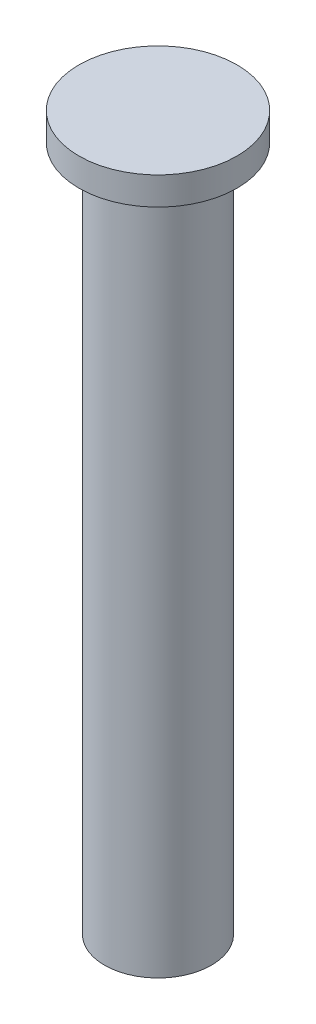
ISO-10303-21;
HEADER;
FILE_DESCRIPTION(('STEP AP214'),'2;1');
FILE_NAME('part.step','',(''),(''),'','','');
FILE_SCHEMA(('AUTOMOTIVE_DESIGN { 1 0 10303 214 1 1 1 1 }'));
ENDSEC;
DATA;
#1=APPLICATION_CONTEXT('core data for automotive mechanical design processes');
#2=APPLICATION_PROTOCOL_DEFINITION('international standard','automotive_design',2000,#1);
#3=PRODUCT_CONTEXT('',#1,'mechanical');
#4=PRODUCT('Part','Part','',(#3));
#5=PRODUCT_RELATED_PRODUCT_CATEGORY('part','',(#4));
#6=PRODUCT_DEFINITION_FORMATION('','',#4);
#7=PRODUCT_DEFINITION_CONTEXT('part definition',#1,'design');
#8=PRODUCT_DEFINITION('design','',#6,#7);
#9=PRODUCT_DEFINITION_SHAPE('','',#8);
#10=(LENGTH_UNIT() NAMED_UNIT(*) SI_UNIT(.MILLI.,.METRE.));
#11=(NAMED_UNIT(*) PLANE_ANGLE_UNIT() SI_UNIT($,.RADIAN.));
#12=(NAMED_UNIT(*) SI_UNIT($,.STERADIAN.) SOLID_ANGLE_UNIT());
#13=UNCERTAINTY_MEASURE_WITH_UNIT(LENGTH_MEASURE(1.E-05),#10,'distance_accuracy_value','');
#14=(GEOMETRIC_REPRESENTATION_CONTEXT(3) GLOBAL_UNCERTAINTY_ASSIGNED_CONTEXT((#13)) GLOBAL_UNIT_ASSIGNED_CONTEXT((#10,
#11,#12)) REPRESENTATION_CONTEXT('',''));
#15=CARTESIAN_POINT('',(0.,0.,0.));
#16=DIRECTION('',(0.,0.,1.));
#17=DIRECTION('',(1.,0.,0.));
#18=AXIS2_PLACEMENT_3D('',#15,#16,#17);
#19=CARTESIAN_POINT('',(0.,0.,0.));
#20=DIRECTION('',(0.,1.,0.));
#21=DIRECTION('',(0.,0.,1.));
#22=AXIS2_PLACEMENT_3D('',#19,#20,#21);
#23=PLANE('',#22);
#24=CARTESIAN_POINT('',(0.,0.,0.));
#25=DIRECTION('',(0.,1.,0.));
#26=DIRECTION('',(0.,0.,1.));
#27=AXIS2_PLACEMENT_3D('',#24,#25,#26);
#28=CIRCLE('',#27,2.3);
#29=CARTESIAN_POINT('',(0.,0.,2.3));
#30=VERTEX_POINT('',#29);
#31=EDGE_CURVE('E34',#30,#30,#28,.T.);
#32=ORIENTED_EDGE('',*,*,#31,.F.);
#33=EDGE_LOOP('',(#32));
#34=FACE_BOUND('',#33,.T.);
#35=CARTESIAN_POINT('',(0.,0.,0.));
#36=DIRECTION('',(0.,1.,0.));
#37=DIRECTION('',(0.,0.,1.));
#38=AXIS2_PLACEMENT_3D('',#35,#36,#37);
#39=CIRCLE('',#38,1.8);
#40=CARTESIAN_POINT('',(0.,0.,1.8));
#41=VERTEX_POINT('',#40);
#42=EDGE_CURVE('E41',#41,#41,#39,.T.);
#43=ORIENTED_EDGE('',*,*,#42,.T.);
#44=EDGE_LOOP('',(#43));
#45=FACE_BOUND('',#44,.T.);
#46=ADVANCED_FACE('F30',(#34,#45),#23,.F.);
#47=CARTESIAN_POINT('',(0.,29.5,0.));
#48=DIRECTION('',(0.,-1.,0.));
#49=DIRECTION('',(0.,0.,-1.));
#50=AXIS2_PLACEMENT_3D('',#47,#48,#49);
#51=CYLINDRICAL_SURFACE('',#50,2.3);
#52=CARTESIAN_POINT('',(0.,29.5,0.));
#53=DIRECTION('',(0.,1.,0.));
#54=DIRECTION('',(0.,0.,1.));
#55=AXIS2_PLACEMENT_3D('',#52,#53,#54);
#56=CIRCLE('',#55,2.3);
#57=CARTESIAN_POINT('',(0.,29.5,2.3));
#58=VERTEX_POINT('',#57);
#59=EDGE_CURVE('E10',#58,#58,#56,.T.);
#60=ORIENTED_EDGE('',*,*,#59,.F.);
#61=EDGE_LOOP('',(#60));
#62=FACE_BOUND('',#61,.T.);
#63=ORIENTED_EDGE('',*,*,#31,.T.);
#64=EDGE_LOOP('',(#63));
#65=FACE_BOUND('',#64,.T.);
#66=ADVANCED_FACE('F32',(#62,#65),#51,.T.);
#67=CARTESIAN_POINT('',(0.,29.5,0.));
#68=DIRECTION('',(0.,-1.,0.));
#69=DIRECTION('',(0.,0.,-1.));
#70=AXIS2_PLACEMENT_3D('',#67,#68,#69);
#71=CYLINDRICAL_SURFACE('',#70,1.8);
#72=CARTESIAN_POINT('',(0.,29.5,0.));
#73=DIRECTION('',(0.,1.,0.));
#74=DIRECTION('',(0.,0.,1.));
#75=AXIS2_PLACEMENT_3D('',#72,#73,#74);
#76=CIRCLE('',#75,1.8);
#77=CARTESIAN_POINT('',(0.,29.5,1.8));
#78=VERTEX_POINT('',#77);
#79=EDGE_CURVE('E45',#78,#78,#76,.T.);
#80=ORIENTED_EDGE('',*,*,#79,.T.);
#81=EDGE_LOOP('',(#80));
#82=FACE_BOUND('',#81,.T.);
#83=ORIENTED_EDGE('',*,*,#42,.F.);
#84=EDGE_LOOP('',(#83));
#85=FACE_BOUND('',#84,.T.);
#86=ADVANCED_FACE('F72',(#82,#85),#71,.F.);
#87=CARTESIAN_POINT('',(0.,29.5,0.));
#88=DIRECTION('',(0.,1.,0.));
#89=DIRECTION('',(0.,0.,1.));
#90=AXIS2_PLACEMENT_3D('',#87,#88,#89);
#91=PLANE('',#90);
#92=ORIENTED_EDGE('',*,*,#79,.F.);
#93=EDGE_LOOP('',(#92));
#94=FACE_BOUND('',#93,.T.);
#95=ADVANCED_FACE('F60',(#94),#91,.F.);
#96=CARTESIAN_POINT('',(0.,30.7,0.));
#97=DIRECTION('',(0.,-1.,0.));
#98=DIRECTION('',(0.,0.,-1.));
#99=AXIS2_PLACEMENT_3D('',#96,#97,#98);
#100=CYLINDRICAL_SURFACE('',#99,3.4);
#101=CARTESIAN_POINT('',(0.,30.7,0.));
#102=DIRECTION('',(0.,1.,0.));
#103=DIRECTION('',(0.,0.,1.));
#104=AXIS2_PLACEMENT_3D('',#101,#102,#103);
#105=CIRCLE('',#104,3.4);
#106=CARTESIAN_POINT('',(0.,30.7,3.4));
#107=VERTEX_POINT('',#106);
#108=EDGE_CURVE('E48',#107,#107,#105,.T.);
#109=ORIENTED_EDGE('',*,*,#108,.F.);
#110=EDGE_LOOP('',(#109));
#111=FACE_BOUND('',#110,.T.);
#112=CARTESIAN_POINT('',(0.,29.5,0.));
#113=DIRECTION('',(0.,1.,0.));
#114=DIRECTION('',(0.,0.,1.));
#115=AXIS2_PLACEMENT_3D('',#112,#113,#114);
#116=CIRCLE('',#115,3.4);
#117=CARTESIAN_POINT('',(0.,29.5,3.4));
#118=VERTEX_POINT('',#117);
#119=EDGE_CURVE('E49',#118,#118,#116,.T.);
#120=ORIENTED_EDGE('',*,*,#119,.T.);
#121=EDGE_LOOP('',(#120));
#122=FACE_BOUND('',#121,.T.);
#123=ADVANCED_FACE('F57',(#111,#122),#100,.T.);
#124=CARTESIAN_POINT('',(0.,30.7,0.));
#125=DIRECTION('',(0.,1.,0.));
#126=DIRECTION('',(0.,0.,1.));
#127=AXIS2_PLACEMENT_3D('',#124,#125,#126);
#128=PLANE('',#127);
#129=ORIENTED_EDGE('',*,*,#108,.T.);
#130=EDGE_LOOP('',(#129));
#131=FACE_BOUND('',#130,.T.);
#132=ADVANCED_FACE('F55',(#131),#128,.T.);
#133=ORIENTED_EDGE('',*,*,#59,.T.);
#134=EDGE_LOOP('',(#133));
#135=FACE_BOUND('',#134,.T.);
#136=ORIENTED_EDGE('',*,*,#119,.F.);
#137=EDGE_LOOP('',(#136));
#138=FACE_BOUND('',#137,.T.);
#139=ADVANCED_FACE('F64',(#135,#138),#91,.F.);
#140=CLOSED_SHELL('',(#46,#66,#86,#95,#123,#132,#139));
#141=MANIFOLD_SOLID_BREP('B2',#140);
#142=ADVANCED_BREP_SHAPE_REPRESENTATION('',(#18,#141),#14);
#143=SHAPE_DEFINITION_REPRESENTATION(#9,#142);
ENDSEC;
END-ISO-10303-21;
